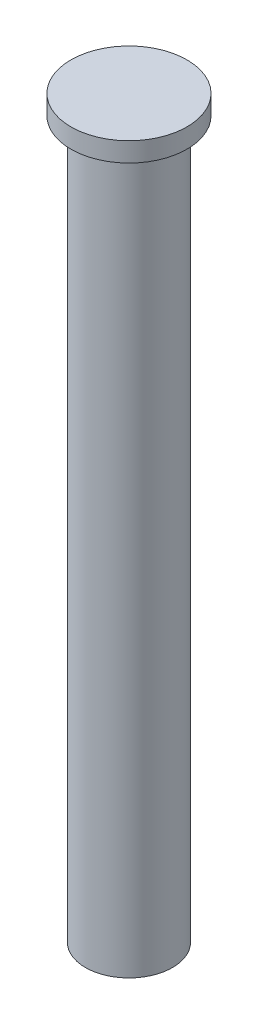
ISO-10303-21;
HEADER;
FILE_DESCRIPTION(('STEP AP214'),'2;1');
FILE_NAME('part.step','',(''),(''),'','','');
FILE_SCHEMA(('AUTOMOTIVE_DESIGN { 1 0 10303 214 1 1 1 1 }'));
ENDSEC;
DATA;
#1=APPLICATION_CONTEXT('core data for automotive mechanical design processes');
#2=APPLICATION_PROTOCOL_DEFINITION('international standard','automotive_design',2000,#1);
#3=PRODUCT_CONTEXT('',#1,'mechanical');
#4=PRODUCT('Part','Part','',(#3));
#5=PRODUCT_RELATED_PRODUCT_CATEGORY('part','',(#4));
#6=PRODUCT_DEFINITION_FORMATION('','',#4);
#7=PRODUCT_DEFINITION_CONTEXT('part definition',#1,'design');
#8=PRODUCT_DEFINITION('design','',#6,#7);
#9=PRODUCT_DEFINITION_SHAPE('','',#8);
#10=(LENGTH_UNIT() NAMED_UNIT(*) SI_UNIT(.MILLI.,.METRE.));
#11=(NAMED_UNIT(*) PLANE_ANGLE_UNIT() SI_UNIT($,.RADIAN.));
#12=(NAMED_UNIT(*) SI_UNIT($,.STERADIAN.) SOLID_ANGLE_UNIT());
#13=UNCERTAINTY_MEASURE_WITH_UNIT(LENGTH_MEASURE(1.E-05),#10,'distance_accuracy_value','');
#14=(GEOMETRIC_REPRESENTATION_CONTEXT(3) GLOBAL_UNCERTAINTY_ASSIGNED_CONTEXT((#13)) GLOBAL_UNIT_ASSIGNED_CONTEXT((#10,
#11,#12)) REPRESENTATION_CONTEXT('',''));
#15=CARTESIAN_POINT('',(0.,0.,0.));
#16=DIRECTION('',(0.,0.,1.));
#17=DIRECTION('',(1.,0.,0.));
#18=AXIS2_PLACEMENT_3D('',#15,#16,#17);
#19=CARTESIAN_POINT('',(0.,90.,0.));
#20=DIRECTION('',(0.,1.,0.));
#21=DIRECTION('',(-1.,0.,0.));
#22=AXIS2_PLACEMENT_3D('',#19,#20,#21);
#23=PLANE('',#22);
#24=CARTESIAN_POINT('',(0.,90.,0.));
#25=DIRECTION('',(0.,1.,0.));
#26=DIRECTION('',(-1.,0.,0.));
#27=AXIS2_PLACEMENT_3D('',#24,#25,#26);
#28=CIRCLE('',#27,30.);
#29=CARTESIAN_POINT('',(-30.,90.,0.));
#30=VERTEX_POINT('',#29);
#31=EDGE_CURVE('E53',#30,#30,#28,.T.);
#32=ORIENTED_EDGE('',*,*,#31,.T.);
#33=EDGE_LOOP('',(#32));
#34=FACE_BOUND('',#33,.T.);
#35=ADVANCED_FACE('F39',(#34),#23,.T.);
#36=CARTESIAN_POINT('',(22.5,-290.,0.));
#37=DIRECTION('',(0.,-1.,0.));
#38=DIRECTION('',(1.,0.,0.));
#39=AXIS2_PLACEMENT_3D('',#36,#37,#38);
#40=PLANE('',#39);
#41=CARTESIAN_POINT('',(0.,-290.,0.));
#42=DIRECTION('',(0.,1.,0.));
#43=DIRECTION('',(-1.,0.,0.));
#44=AXIS2_PLACEMENT_3D('',#41,#42,#43);
#45=CIRCLE('',#44,22.5);
#46=CARTESIAN_POINT('',(-22.5,-290.,0.));
#47=VERTEX_POINT('',#46);
#48=EDGE_CURVE('E10',#47,#47,#45,.T.);
#49=ORIENTED_EDGE('',*,*,#48,.F.);
#50=EDGE_LOOP('',(#49));
#51=FACE_BOUND('',#50,.T.);
#52=ADVANCED_FACE('F75',(#51),#40,.T.);
#53=CARTESIAN_POINT('',(0.,90.,0.));
#54=DIRECTION('',(0.,1.,0.));
#55=DIRECTION('',(-1.,0.,0.));
#56=AXIS2_PLACEMENT_3D('',#53,#54,#55);
#57=CYLINDRICAL_SURFACE('',#56,22.5);
#58=CARTESIAN_POINT('',(0.,80.,0.));
#59=DIRECTION('',(0.,1.,0.));
#60=DIRECTION('',(-1.,0.,0.));
#61=AXIS2_PLACEMENT_3D('',#58,#59,#60);
#62=CIRCLE('',#61,22.5);
#63=CARTESIAN_POINT('',(-22.5,80.,0.));
#64=VERTEX_POINT('',#63);
#65=EDGE_CURVE('E45',#64,#64,#62,.T.);
#66=ORIENTED_EDGE('',*,*,#65,.F.);
#67=EDGE_LOOP('',(#66));
#68=FACE_BOUND('',#67,.T.);
#69=ORIENTED_EDGE('',*,*,#48,.T.);
#70=EDGE_LOOP('',(#69));
#71=FACE_BOUND('',#70,.T.);
#72=ADVANCED_FACE('F70',(#68,#71),#57,.T.);
#73=CARTESIAN_POINT('',(30.,80.,0.));
#74=DIRECTION('',(0.,-1.,0.));
#75=DIRECTION('',(1.,0.,0.));
#76=AXIS2_PLACEMENT_3D('',#73,#74,#75);
#77=PLANE('',#76);
#78=ORIENTED_EDGE('',*,*,#65,.T.);
#79=EDGE_LOOP('',(#78));
#80=FACE_BOUND('',#79,.T.);
#81=CARTESIAN_POINT('',(0.,80.,0.));
#82=DIRECTION('',(0.,1.,0.));
#83=DIRECTION('',(-1.,0.,0.));
#84=AXIS2_PLACEMENT_3D('',#81,#82,#83);
#85=CIRCLE('',#84,30.);
#86=CARTESIAN_POINT('',(-30.,80.,0.));
#87=VERTEX_POINT('',#86);
#88=EDGE_CURVE('E49',#87,#87,#85,.T.);
#89=ORIENTED_EDGE('',*,*,#88,.F.);
#90=EDGE_LOOP('',(#89));
#91=FACE_BOUND('',#90,.T.);
#92=ADVANCED_FACE('F65',(#80,#91),#77,.T.);
#93=CARTESIAN_POINT('',(0.,90.,0.));
#94=DIRECTION('',(0.,1.,0.));
#95=DIRECTION('',(-1.,0.,0.));
#96=AXIS2_PLACEMENT_3D('',#93,#94,#95);
#97=CYLINDRICAL_SURFACE('',#96,30.);
#98=ORIENTED_EDGE('',*,*,#31,.F.);
#99=EDGE_LOOP('',(#98));
#100=FACE_BOUND('',#99,.T.);
#101=ORIENTED_EDGE('',*,*,#88,.T.);
#102=EDGE_LOOP('',(#101));
#103=FACE_BOUND('',#102,.T.);
#104=ADVANCED_FACE('F62',(#100,#103),#97,.T.);
#105=CLOSED_SHELL('',(#35,#52,#72,#92,#104));
#106=MANIFOLD_SOLID_BREP('B2',#105);
#107=ADVANCED_BREP_SHAPE_REPRESENTATION('',(#18,#106),#14);
#108=SHAPE_DEFINITION_REPRESENTATION(#9,#107);
ENDSEC;
END-ISO-10303-21;
